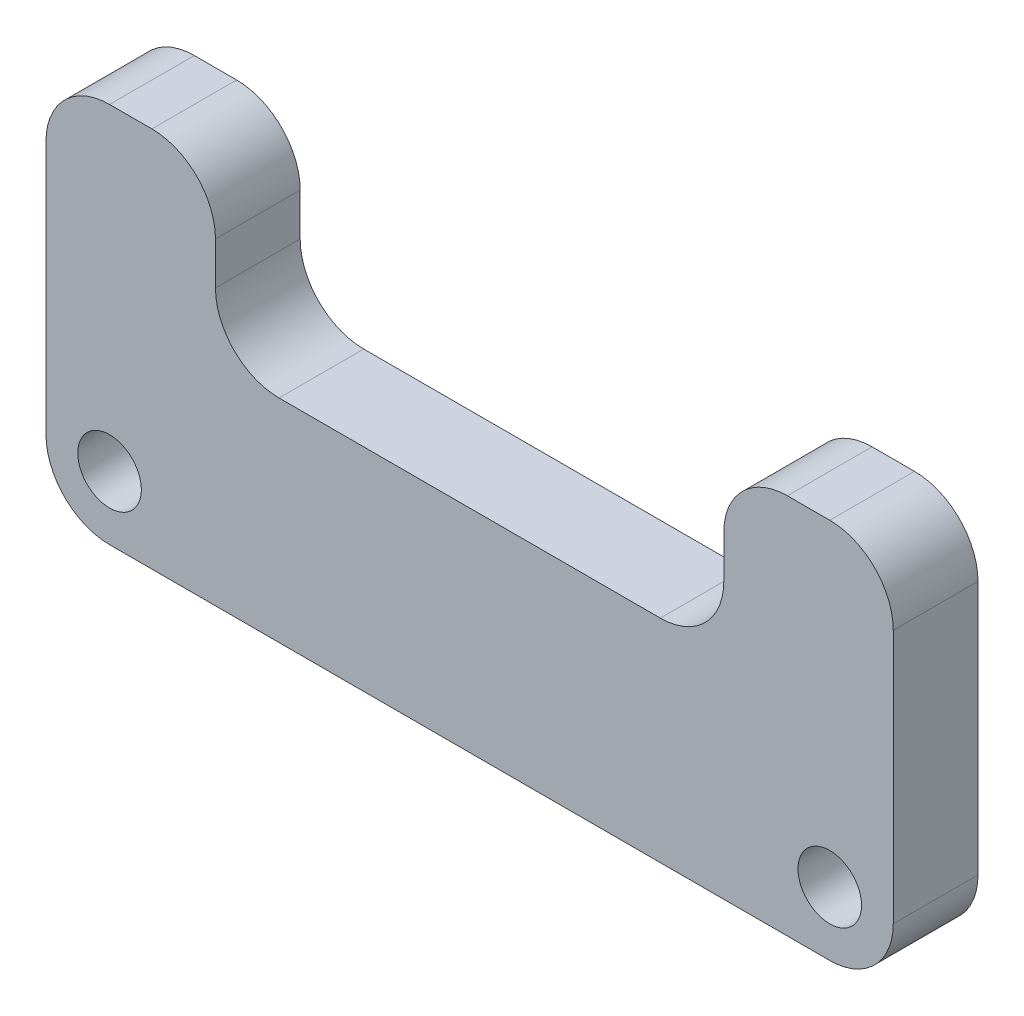
ISO-10303-21;
HEADER;
FILE_DESCRIPTION(('STEP AP214'),'2;1');
FILE_NAME('part.step','',(''),(''),'','','');
FILE_SCHEMA(('AUTOMOTIVE_DESIGN { 1 0 10303 214 1 1 1 1 }'));
ENDSEC;
DATA;
#1=APPLICATION_CONTEXT('core data for automotive mechanical design processes');
#2=APPLICATION_PROTOCOL_DEFINITION('international standard','automotive_design',2000,#1);
#3=PRODUCT_CONTEXT('',#1,'mechanical');
#4=PRODUCT('Part','Part','',(#3));
#5=PRODUCT_RELATED_PRODUCT_CATEGORY('part','',(#4));
#6=PRODUCT_DEFINITION_FORMATION('','',#4);
#7=PRODUCT_DEFINITION_CONTEXT('part definition',#1,'design');
#8=PRODUCT_DEFINITION('design','',#6,#7);
#9=PRODUCT_DEFINITION_SHAPE('','',#8);
#10=(LENGTH_UNIT() NAMED_UNIT(*) SI_UNIT(.MILLI.,.METRE.));
#11=(NAMED_UNIT(*) PLANE_ANGLE_UNIT() SI_UNIT($,.RADIAN.));
#12=(NAMED_UNIT(*) SI_UNIT($,.STERADIAN.) SOLID_ANGLE_UNIT());
#13=UNCERTAINTY_MEASURE_WITH_UNIT(LENGTH_MEASURE(1.E-05),#10,'distance_accuracy_value','');
#14=(GEOMETRIC_REPRESENTATION_CONTEXT(3) GLOBAL_UNCERTAINTY_ASSIGNED_CONTEXT((#13)) GLOBAL_UNIT_ASSIGNED_CONTEXT((#10,
#11,#12)) REPRESENTATION_CONTEXT('',''));
#15=CARTESIAN_POINT('',(0.,0.,0.));
#16=DIRECTION('',(0.,0.,1.));
#17=DIRECTION('',(1.,0.,0.));
#18=AXIS2_PLACEMENT_3D('',#15,#16,#17);
#19=CARTESIAN_POINT('',(-85.,15.,20.));
#20=DIRECTION('',(0.,0.,-1.));
#21=DIRECTION('',(-1.,0.,0.));
#22=AXIS2_PLACEMENT_3D('',#19,#20,#21);
#23=PLANE('',#22);
#24=CARTESIAN_POINT('',(-85.,15.,20.));
#25=DIRECTION('',(0.,0.,1.));
#26=DIRECTION('',(-1.,0.,0.));
#27=AXIS2_PLACEMENT_3D('',#24,#25,#26);
#28=CIRCLE('',#27,15.);
#29=CARTESIAN_POINT('',(-100.,15.0000000000002,20.));
#30=VERTEX_POINT('',#29);
#31=CARTESIAN_POINT('',(-85.,0.,20.));
#32=VERTEX_POINT('',#31);
#33=EDGE_CURVE('E240',#30,#32,#28,.T.);
#34=ORIENTED_EDGE('',*,*,#33,.T.);
#35=DIRECTION('',(1.,0.,0.));
#36=VECTOR('',#35,1.);
#37=CARTESIAN_POINT('',(-85.,0.,20.));
#38=LINE('',#37,#36);
#39=CARTESIAN_POINT('',(84.9999999999999,0.,20.));
#40=VERTEX_POINT('',#39);
#41=EDGE_CURVE('E128',#32,#40,#38,.T.);
#42=ORIENTED_EDGE('',*,*,#41,.T.);
#43=CARTESIAN_POINT('',(85.,15.,20.));
#44=DIRECTION('',(0.,0.,1.));
#45=DIRECTION('',(1.,0.,0.));
#46=AXIS2_PLACEMENT_3D('',#43,#44,#45);
#47=CIRCLE('',#46,15.);
#48=CARTESIAN_POINT('',(100.,15.,20.));
#49=VERTEX_POINT('',#48);
#50=EDGE_CURVE('E293',#40,#49,#47,.T.);
#51=ORIENTED_EDGE('',*,*,#50,.T.);
#52=DIRECTION('',(0.,1.,0.));
#53=VECTOR('',#52,1.);
#54=CARTESIAN_POINT('',(100.,15.0000000000001,20.));
#55=LINE('',#54,#53);
#56=CARTESIAN_POINT('',(100.,74.9999999999999,20.));
#57=VERTEX_POINT('',#56);
#58=EDGE_CURVE('E313',#49,#57,#55,.T.);
#59=ORIENTED_EDGE('',*,*,#58,.T.);
#60=CARTESIAN_POINT('',(85.,75.,20.));
#61=DIRECTION('',(0.,0.,1.));
#62=DIRECTION('',(1.,0.,0.));
#63=AXIS2_PLACEMENT_3D('',#60,#61,#62);
#64=CIRCLE('',#63,15.);
#65=CARTESIAN_POINT('',(84.9999999999999,90.,20.));
#66=VERTEX_POINT('',#65);
#67=EDGE_CURVE('E309',#57,#66,#64,.T.);
#68=ORIENTED_EDGE('',*,*,#67,.T.);
#69=DIRECTION('',(-1.,0.,0.));
#70=VECTOR('',#69,1.);
#71=CARTESIAN_POINT('',(84.9999999999999,90.,20.));
#72=LINE('',#71,#70);
#73=CARTESIAN_POINT('',(75.0000000000001,90.,20.));
#74=VERTEX_POINT('',#73);
#75=EDGE_CURVE('E312',#66,#74,#72,.T.);
#76=ORIENTED_EDGE('',*,*,#75,.T.);
#77=CARTESIAN_POINT('',(75.,75.,20.));
#78=DIRECTION('',(0.,0.,1.));
#79=DIRECTION('',(1.,0.,0.));
#80=AXIS2_PLACEMENT_3D('',#77,#78,#79);
#81=CIRCLE('',#80,15.);
#82=CARTESIAN_POINT('',(60.,74.9999999999999,20.));
#83=VERTEX_POINT('',#82);
#84=EDGE_CURVE('E317',#74,#83,#81,.T.);
#85=ORIENTED_EDGE('',*,*,#84,.T.);
#86=DIRECTION('',(0.,-1.,0.));
#87=VECTOR('',#86,1.);
#88=CARTESIAN_POINT('',(60.,74.9999999999999,20.));
#89=LINE('',#88,#87);
#90=CARTESIAN_POINT('',(60.,65.0000000000001,20.));
#91=VERTEX_POINT('',#90);
#92=EDGE_CURVE('E324',#83,#91,#89,.T.);
#93=ORIENTED_EDGE('',*,*,#92,.T.);
#94=CARTESIAN_POINT('',(45.,65.,20.));
#95=DIRECTION('',(0.,0.,-1.));
#96=DIRECTION('',(-1.,0.,0.));
#97=AXIS2_PLACEMENT_3D('',#94,#95,#96);
#98=CIRCLE('',#97,15.);
#99=CARTESIAN_POINT('',(44.9999999999999,50.,20.));
#100=VERTEX_POINT('',#99);
#101=EDGE_CURVE('E327',#91,#100,#98,.T.);
#102=ORIENTED_EDGE('',*,*,#101,.T.);
#103=DIRECTION('',(-1.,0.,0.));
#104=VECTOR('',#103,1.);
#105=CARTESIAN_POINT('',(44.9999999999999,50.,20.));
#106=LINE('',#105,#104);
#107=CARTESIAN_POINT('',(-44.9999999999999,50.,20.));
#108=VERTEX_POINT('',#107);
#109=EDGE_CURVE('E330',#100,#108,#106,.T.);
#110=ORIENTED_EDGE('',*,*,#109,.T.);
#111=CARTESIAN_POINT('',(-45.,65.,20.));
#112=DIRECTION('',(0.,0.,-1.));
#113=DIRECTION('',(1.,0.,0.));
#114=AXIS2_PLACEMENT_3D('',#111,#112,#113);
#115=CIRCLE('',#114,15.);
#116=CARTESIAN_POINT('',(-60.,65.0000000000001,20.));
#117=VERTEX_POINT('',#116);
#118=EDGE_CURVE('E333',#108,#117,#115,.T.);
#119=ORIENTED_EDGE('',*,*,#118,.T.);
#120=DIRECTION('',(0.,1.,0.));
#121=VECTOR('',#120,1.);
#122=CARTESIAN_POINT('',(-60.,74.9999999999999,20.));
#123=LINE('',#122,#121);
#124=CARTESIAN_POINT('',(-60.,74.9999999999999,20.));
#125=VERTEX_POINT('',#124);
#126=EDGE_CURVE('E336',#117,#125,#123,.T.);
#127=ORIENTED_EDGE('',*,*,#126,.T.);
#128=CARTESIAN_POINT('',(-75.,75.,20.));
#129=DIRECTION('',(0.,0.,1.));
#130=DIRECTION('',(-1.,0.,0.));
#131=AXIS2_PLACEMENT_3D('',#128,#129,#130);
#132=CIRCLE('',#131,15.);
#133=CARTESIAN_POINT('',(-75.0000000000001,90.,20.));
#134=VERTEX_POINT('',#133);
#135=EDGE_CURVE('E171',#125,#134,#132,.T.);
#136=ORIENTED_EDGE('',*,*,#135,.T.);
#137=DIRECTION('',(-1.,0.,0.));
#138=VECTOR('',#137,1.);
#139=CARTESIAN_POINT('',(-84.9999999999999,90.,20.));
#140=LINE('',#139,#138);
#141=CARTESIAN_POINT('',(-84.9999999999999,90.,20.));
#142=VERTEX_POINT('',#141);
#143=EDGE_CURVE('E165',#134,#142,#140,.T.);
#144=ORIENTED_EDGE('',*,*,#143,.T.);
#145=CARTESIAN_POINT('',(-85.,75.,20.));
#146=DIRECTION('',(0.,0.,1.));
#147=DIRECTION('',(-1.,0.,0.));
#148=AXIS2_PLACEMENT_3D('',#145,#146,#147);
#149=CIRCLE('',#148,15.);
#150=CARTESIAN_POINT('',(-100.,74.9999999999999,20.));
#151=VERTEX_POINT('',#150);
#152=EDGE_CURVE('E169',#142,#151,#149,.T.);
#153=ORIENTED_EDGE('',*,*,#152,.T.);
#154=DIRECTION('',(0.,-1.,0.));
#155=VECTOR('',#154,1.);
#156=CARTESIAN_POINT('',(-100.,15.0000000000002,20.));
#157=LINE('',#156,#155);
#158=EDGE_CURVE('E61',#151,#30,#157,.T.);
#159=ORIENTED_EDGE('',*,*,#158,.T.);
#160=EDGE_LOOP('',(#34,#42,#51,#59,#68,#76,#85,#93,#102,#110,#119,#127,#136,#144,#153,#159));
#161=FACE_BOUND('',#160,.T.);
#162=CARTESIAN_POINT('',(85.,15.,20.));
#163=DIRECTION('',(0.,0.,1.));
#164=DIRECTION('',(1.,0.,0.));
#165=AXIS2_PLACEMENT_3D('',#162,#163,#164);
#166=CIRCLE('',#165,7.50000000000001);
#167=CARTESIAN_POINT('',(92.5,15.,20.));
#168=VERTEX_POINT('',#167);
#169=EDGE_CURVE('E198',#168,#168,#166,.T.);
#170=ORIENTED_EDGE('',*,*,#169,.F.);
#171=EDGE_LOOP('',(#170));
#172=FACE_BOUND('',#171,.T.);
#173=CARTESIAN_POINT('',(-85.,15.,20.));
#174=DIRECTION('',(0.,0.,1.));
#175=DIRECTION('',(-1.,0.,0.));
#176=AXIS2_PLACEMENT_3D('',#173,#174,#175);
#177=CIRCLE('',#176,7.50000000000001);
#178=CARTESIAN_POINT('',(-92.5,15.,20.));
#179=VERTEX_POINT('',#178);
#180=EDGE_CURVE('E379',#179,#179,#177,.T.);
#181=ORIENTED_EDGE('',*,*,#180,.F.);
#182=EDGE_LOOP('',(#181));
#183=FACE_BOUND('',#182,.T.);
#184=ADVANCED_FACE('F43',(#161,#172,#183),#23,.F.);
#185=CARTESIAN_POINT('',(-85.,15.,0.));
#186=DIRECTION('',(0.,0.,-1.));
#187=DIRECTION('',(-1.,0.,0.));
#188=AXIS2_PLACEMENT_3D('',#185,#186,#187);
#189=PLANE('',#188);
#190=CARTESIAN_POINT('',(85.,15.,0.));
#191=DIRECTION('',(0.,0.,1.));
#192=DIRECTION('',(1.,0.,0.));
#193=AXIS2_PLACEMENT_3D('',#190,#191,#192);
#194=CIRCLE('',#193,7.50000000000001);
#195=CARTESIAN_POINT('',(92.5,15.,0.));
#196=VERTEX_POINT('',#195);
#197=EDGE_CURVE('E386',#196,#196,#194,.T.);
#198=ORIENTED_EDGE('',*,*,#197,.T.);
#199=EDGE_LOOP('',(#198));
#200=FACE_BOUND('',#199,.T.);
#201=CARTESIAN_POINT('',(-85.,15.,0.));
#202=DIRECTION('',(0.,0.,1.));
#203=DIRECTION('',(-1.,0.,0.));
#204=AXIS2_PLACEMENT_3D('',#201,#202,#203);
#205=CIRCLE('',#204,15.);
#206=CARTESIAN_POINT('',(-100.,15.0000000000002,0.));
#207=VERTEX_POINT('',#206);
#208=CARTESIAN_POINT('',(-85.,0.,0.));
#209=VERTEX_POINT('',#208);
#210=EDGE_CURVE('E193',#207,#209,#205,.T.);
#211=ORIENTED_EDGE('',*,*,#210,.F.);
#212=DIRECTION('',(0.,-1.,0.));
#213=VECTOR('',#212,1.);
#214=CARTESIAN_POINT('',(-100.,15.0000000000002,0.));
#215=LINE('',#214,#213);
#216=CARTESIAN_POINT('',(-100.,74.9999999999999,0.));
#217=VERTEX_POINT('',#216);
#218=EDGE_CURVE('E120',#217,#207,#215,.T.);
#219=ORIENTED_EDGE('',*,*,#218,.F.);
#220=CARTESIAN_POINT('',(-85.,75.,0.));
#221=DIRECTION('',(0.,0.,1.));
#222=DIRECTION('',(-1.,0.,0.));
#223=AXIS2_PLACEMENT_3D('',#220,#221,#222);
#224=CIRCLE('',#223,15.);
#225=CARTESIAN_POINT('',(-84.9999999999999,90.,0.));
#226=VERTEX_POINT('',#225);
#227=EDGE_CURVE('E114',#226,#217,#224,.T.);
#228=ORIENTED_EDGE('',*,*,#227,.F.);
#229=DIRECTION('',(-1.,0.,0.));
#230=VECTOR('',#229,1.);
#231=CARTESIAN_POINT('',(-84.9999999999999,90.,0.));
#232=LINE('',#231,#230);
#233=CARTESIAN_POINT('',(-75.0000000000001,90.,0.));
#234=VERTEX_POINT('',#233);
#235=EDGE_CURVE('E180',#234,#226,#232,.T.);
#236=ORIENTED_EDGE('',*,*,#235,.F.);
#237=CARTESIAN_POINT('',(-75.,75.,0.));
#238=DIRECTION('',(0.,0.,1.));
#239=DIRECTION('',(-1.,0.,0.));
#240=AXIS2_PLACEMENT_3D('',#237,#238,#239);
#241=CIRCLE('',#240,15.);
#242=CARTESIAN_POINT('',(-60.,74.9999999999999,0.));
#243=VERTEX_POINT('',#242);
#244=EDGE_CURVE('E231',#243,#234,#241,.T.);
#245=ORIENTED_EDGE('',*,*,#244,.F.);
#246=DIRECTION('',(0.,1.,0.));
#247=VECTOR('',#246,1.);
#248=CARTESIAN_POINT('',(-60.,74.9999999999999,0.));
#249=LINE('',#248,#247);
#250=CARTESIAN_POINT('',(-60.,65.0000000000001,0.));
#251=VERTEX_POINT('',#250);
#252=EDGE_CURVE('E228',#251,#243,#249,.T.);
#253=ORIENTED_EDGE('',*,*,#252,.F.);
#254=CARTESIAN_POINT('',(-45.,65.,0.));
#255=DIRECTION('',(0.,0.,-1.));
#256=DIRECTION('',(1.,0.,0.));
#257=AXIS2_PLACEMENT_3D('',#254,#255,#256);
#258=CIRCLE('',#257,15.);
#259=CARTESIAN_POINT('',(-44.9999999999999,50.,0.));
#260=VERTEX_POINT('',#259);
#261=EDGE_CURVE('E225',#260,#251,#258,.T.);
#262=ORIENTED_EDGE('',*,*,#261,.F.);
#263=DIRECTION('',(-1.,0.,0.));
#264=VECTOR('',#263,1.);
#265=CARTESIAN_POINT('',(44.9999999999999,50.,0.));
#266=LINE('',#265,#264);
#267=CARTESIAN_POINT('',(44.9999999999999,50.,0.));
#268=VERTEX_POINT('',#267);
#269=EDGE_CURVE('E222',#268,#260,#266,.T.);
#270=ORIENTED_EDGE('',*,*,#269,.F.);
#271=CARTESIAN_POINT('',(45.,65.,0.));
#272=DIRECTION('',(0.,0.,-1.));
#273=DIRECTION('',(-1.,0.,0.));
#274=AXIS2_PLACEMENT_3D('',#271,#272,#273);
#275=CIRCLE('',#274,15.);
#276=CARTESIAN_POINT('',(60.,65.0000000000001,0.));
#277=VERTEX_POINT('',#276);
#278=EDGE_CURVE('E219',#277,#268,#275,.T.);
#279=ORIENTED_EDGE('',*,*,#278,.F.);
#280=DIRECTION('',(0.,-1.,0.));
#281=VECTOR('',#280,1.);
#282=CARTESIAN_POINT('',(60.,74.9999999999999,0.));
#283=LINE('',#282,#281);
#284=CARTESIAN_POINT('',(60.,74.9999999999999,0.));
#285=VERTEX_POINT('',#284);
#286=EDGE_CURVE('E216',#285,#277,#283,.T.);
#287=ORIENTED_EDGE('',*,*,#286,.F.);
#288=CARTESIAN_POINT('',(75.,75.,0.));
#289=DIRECTION('',(0.,0.,1.));
#290=DIRECTION('',(1.,0.,0.));
#291=AXIS2_PLACEMENT_3D('',#288,#289,#290);
#292=CIRCLE('',#291,15.);
#293=CARTESIAN_POINT('',(75.0000000000001,90.,0.));
#294=VERTEX_POINT('',#293);
#295=EDGE_CURVE('E213',#294,#285,#292,.T.);
#296=ORIENTED_EDGE('',*,*,#295,.F.);
#297=DIRECTION('',(-1.,0.,0.));
#298=VECTOR('',#297,1.);
#299=CARTESIAN_POINT('',(84.9999999999999,90.,0.));
#300=LINE('',#299,#298);
#301=CARTESIAN_POINT('',(84.9999999999999,90.,0.));
#302=VERTEX_POINT('',#301);
#303=EDGE_CURVE('E210',#302,#294,#300,.T.);
#304=ORIENTED_EDGE('',*,*,#303,.F.);
#305=CARTESIAN_POINT('',(85.,75.,0.));
#306=DIRECTION('',(0.,0.,1.));
#307=DIRECTION('',(1.,0.,0.));
#308=AXIS2_PLACEMENT_3D('',#305,#306,#307);
#309=CIRCLE('',#308,15.);
#310=CARTESIAN_POINT('',(100.,74.9999999999999,0.));
#311=VERTEX_POINT('',#310);
#312=EDGE_CURVE('E207',#311,#302,#309,.T.);
#313=ORIENTED_EDGE('',*,*,#312,.F.);
#314=DIRECTION('',(0.,1.,0.));
#315=VECTOR('',#314,1.);
#316=CARTESIAN_POINT('',(100.,15.0000000000001,0.));
#317=LINE('',#316,#315);
#318=CARTESIAN_POINT('',(100.,15.,0.));
#319=VERTEX_POINT('',#318);
#320=EDGE_CURVE('E204',#319,#311,#317,.T.);
#321=ORIENTED_EDGE('',*,*,#320,.F.);
#322=CARTESIAN_POINT('',(85.,15.,0.));
#323=DIRECTION('',(0.,0.,1.));
#324=DIRECTION('',(1.,0.,0.));
#325=AXIS2_PLACEMENT_3D('',#322,#323,#324);
#326=CIRCLE('',#325,15.);
#327=CARTESIAN_POINT('',(84.9999999999999,0.,0.));
#328=VERTEX_POINT('',#327);
#329=EDGE_CURVE('E201',#328,#319,#326,.T.);
#330=ORIENTED_EDGE('',*,*,#329,.F.);
#331=DIRECTION('',(1.,0.,0.));
#332=VECTOR('',#331,1.);
#333=CARTESIAN_POINT('',(-85.,0.,0.));
#334=LINE('',#333,#332);
#335=EDGE_CURVE('E197',#209,#328,#334,.T.);
#336=ORIENTED_EDGE('',*,*,#335,.F.);
#337=EDGE_LOOP('',(#211,#219,#228,#236,#245,#253,#262,#270,#279,#287,#296,#304,#313,#321,#330,#336));
#338=FACE_BOUND('',#337,.T.);
#339=CARTESIAN_POINT('',(-85.,15.,0.));
#340=DIRECTION('',(0.,0.,1.));
#341=DIRECTION('',(-1.,0.,0.));
#342=AXIS2_PLACEMENT_3D('',#339,#340,#341);
#343=CIRCLE('',#342,7.50000000000001);
#344=CARTESIAN_POINT('',(-92.5,15.,0.));
#345=VERTEX_POINT('',#344);
#346=EDGE_CURVE('E382',#345,#345,#343,.T.);
#347=ORIENTED_EDGE('',*,*,#346,.T.);
#348=EDGE_LOOP('',(#347));
#349=FACE_BOUND('',#348,.T.);
#350=ADVANCED_FACE('F297',(#200,#338,#349),#189,.T.);
#351=CARTESIAN_POINT('',(-85.,15.,20.));
#352=DIRECTION('',(0.,0.,-1.));
#353=DIRECTION('',(-1.,0.,0.));
#354=AXIS2_PLACEMENT_3D('',#351,#352,#353);
#355=CYLINDRICAL_SURFACE('',#354,15.);
#356=ORIENTED_EDGE('',*,*,#210,.T.);
#357=DIRECTION('',(0.,0.,-1.));
#358=VECTOR('',#357,1.);
#359=CARTESIAN_POINT('',(-85.,0.,20.));
#360=LINE('',#359,#358);
#361=EDGE_CURVE('E11',#32,#209,#360,.T.);
#362=ORIENTED_EDGE('',*,*,#361,.F.);
#363=ORIENTED_EDGE('',*,*,#33,.F.);
#364=DIRECTION('',(0.,0.,-1.));
#365=VECTOR('',#364,1.);
#366=CARTESIAN_POINT('',(-100.,15.0000000000002,20.));
#367=LINE('',#366,#365);
#368=EDGE_CURVE('E189',#30,#207,#367,.T.);
#369=ORIENTED_EDGE('',*,*,#368,.T.);
#370=EDGE_LOOP('',(#356,#362,#363,#369));
#371=FACE_BOUND('',#370,.T.);
#372=ADVANCED_FACE('F45',(#371),#355,.T.);
#373=CARTESIAN_POINT('',(-85.,0.,20.));
#374=DIRECTION('',(0.,1.,0.));
#375=DIRECTION('',(-1.,0.,0.));
#376=AXIS2_PLACEMENT_3D('',#373,#374,#375);
#377=PLANE('',#376);
#378=ORIENTED_EDGE('',*,*,#335,.T.);
#379=DIRECTION('',(0.,0.,-1.));
#380=VECTOR('',#379,1.);
#381=CARTESIAN_POINT('',(84.9999999999999,0.,20.));
#382=LINE('',#381,#380);
#383=EDGE_CURVE('E53',#40,#328,#382,.T.);
#384=ORIENTED_EDGE('',*,*,#383,.F.);
#385=ORIENTED_EDGE('',*,*,#41,.F.);
#386=ORIENTED_EDGE('',*,*,#361,.T.);
#387=EDGE_LOOP('',(#378,#384,#385,#386));
#388=FACE_BOUND('',#387,.T.);
#389=ADVANCED_FACE('F540',(#388),#377,.F.);
#390=CARTESIAN_POINT('',(85.,15.,20.));
#391=DIRECTION('',(0.,0.,-1.));
#392=DIRECTION('',(-1.,0.,0.));
#393=AXIS2_PLACEMENT_3D('',#390,#391,#392);
#394=CYLINDRICAL_SURFACE('',#393,15.);
#395=ORIENTED_EDGE('',*,*,#329,.T.);
#396=DIRECTION('',(0.,0.,-1.));
#397=VECTOR('',#396,1.);
#398=CARTESIAN_POINT('',(100.,15.,20.));
#399=LINE('',#398,#397);
#400=EDGE_CURVE('E283',#49,#319,#399,.T.);
#401=ORIENTED_EDGE('',*,*,#400,.F.);
#402=ORIENTED_EDGE('',*,*,#50,.F.);
#403=ORIENTED_EDGE('',*,*,#383,.T.);
#404=EDGE_LOOP('',(#395,#401,#402,#403));
#405=FACE_BOUND('',#404,.T.);
#406=ADVANCED_FACE('F291',(#405),#394,.T.);
#407=CARTESIAN_POINT('',(100.,15.0000000000001,20.));
#408=DIRECTION('',(-1.,0.,0.));
#409=DIRECTION('',(0.,0.,1.));
#410=AXIS2_PLACEMENT_3D('',#407,#408,#409);
#411=PLANE('',#410);
#412=ORIENTED_EDGE('',*,*,#320,.T.);
#413=DIRECTION('',(0.,0.,-1.));
#414=VECTOR('',#413,1.);
#415=CARTESIAN_POINT('',(100.,74.9999999999999,20.));
#416=LINE('',#415,#414);
#417=EDGE_CURVE('E279',#57,#311,#416,.T.);
#418=ORIENTED_EDGE('',*,*,#417,.F.);
#419=ORIENTED_EDGE('',*,*,#58,.F.);
#420=ORIENTED_EDGE('',*,*,#400,.T.);
#421=EDGE_LOOP('',(#412,#418,#419,#420));
#422=FACE_BOUND('',#421,.T.);
#423=ADVANCED_FACE('F303',(#422),#411,.F.);
#424=CARTESIAN_POINT('',(85.,75.,20.));
#425=DIRECTION('',(0.,0.,-1.));
#426=DIRECTION('',(-1.,0.,0.));
#427=AXIS2_PLACEMENT_3D('',#424,#425,#426);
#428=CYLINDRICAL_SURFACE('',#427,15.);
#429=ORIENTED_EDGE('',*,*,#312,.T.);
#430=DIRECTION('',(0.,0.,-1.));
#431=VECTOR('',#430,1.);
#432=CARTESIAN_POINT('',(84.9999999999999,90.,20.));
#433=LINE('',#432,#431);
#434=EDGE_CURVE('E275',#66,#302,#433,.T.);
#435=ORIENTED_EDGE('',*,*,#434,.F.);
#436=ORIENTED_EDGE('',*,*,#67,.F.);
#437=ORIENTED_EDGE('',*,*,#417,.T.);
#438=EDGE_LOOP('',(#429,#435,#436,#437));
#439=FACE_BOUND('',#438,.T.);
#440=ADVANCED_FACE('F307',(#439),#428,.T.);
#441=CARTESIAN_POINT('',(84.9999999999999,90.,20.));
#442=DIRECTION('',(0.,-1.,0.));
#443=DIRECTION('',(0.,0.,-1.));
#444=AXIS2_PLACEMENT_3D('',#441,#442,#443);
#445=PLANE('',#444);
#446=ORIENTED_EDGE('',*,*,#303,.T.);
#447=DIRECTION('',(0.,0.,-1.));
#448=VECTOR('',#447,1.);
#449=CARTESIAN_POINT('',(75.0000000000001,90.,20.));
#450=LINE('',#449,#448);
#451=EDGE_CURVE('E271',#74,#294,#450,.T.);
#452=ORIENTED_EDGE('',*,*,#451,.F.);
#453=ORIENTED_EDGE('',*,*,#75,.F.);
#454=ORIENTED_EDGE('',*,*,#434,.T.);
#455=EDGE_LOOP('',(#446,#452,#453,#454));
#456=FACE_BOUND('',#455,.T.);
#457=ADVANCED_FACE('F501',(#456),#445,.F.);
#458=CARTESIAN_POINT('',(75.,75.,20.));
#459=DIRECTION('',(0.,0.,-1.));
#460=DIRECTION('',(-1.,0.,0.));
#461=AXIS2_PLACEMENT_3D('',#458,#459,#460);
#462=CYLINDRICAL_SURFACE('',#461,15.);
#463=ORIENTED_EDGE('',*,*,#295,.T.);
#464=DIRECTION('',(0.,0.,-1.));
#465=VECTOR('',#464,1.);
#466=CARTESIAN_POINT('',(60.,74.9999999999999,20.));
#467=LINE('',#466,#465);
#468=EDGE_CURVE('E267',#83,#285,#467,.T.);
#469=ORIENTED_EDGE('',*,*,#468,.F.);
#470=ORIENTED_EDGE('',*,*,#84,.F.);
#471=ORIENTED_EDGE('',*,*,#451,.T.);
#472=EDGE_LOOP('',(#463,#469,#470,#471));
#473=FACE_BOUND('',#472,.T.);
#474=ADVANCED_FACE('F490',(#473),#462,.T.);
#475=CARTESIAN_POINT('',(60.,74.9999999999999,20.));
#476=DIRECTION('',(1.,0.,0.));
#477=DIRECTION('',(0.,0.,-1.));
#478=AXIS2_PLACEMENT_3D('',#475,#476,#477);
#479=PLANE('',#478);
#480=ORIENTED_EDGE('',*,*,#286,.T.);
#481=DIRECTION('',(0.,0.,-1.));
#482=VECTOR('',#481,1.);
#483=CARTESIAN_POINT('',(60.,65.0000000000001,20.));
#484=LINE('',#483,#482);
#485=EDGE_CURVE('E263',#91,#277,#484,.T.);
#486=ORIENTED_EDGE('',*,*,#485,.F.);
#487=ORIENTED_EDGE('',*,*,#92,.F.);
#488=ORIENTED_EDGE('',*,*,#468,.T.);
#489=EDGE_LOOP('',(#480,#486,#487,#488));
#490=FACE_BOUND('',#489,.T.);
#491=ADVANCED_FACE('F479',(#490),#479,.F.);
#492=CARTESIAN_POINT('',(45.,65.,20.));
#493=DIRECTION('',(0.,0.,-1.));
#494=DIRECTION('',(-1.,0.,0.));
#495=AXIS2_PLACEMENT_3D('',#492,#493,#494);
#496=CYLINDRICAL_SURFACE('',#495,15.);
#497=ORIENTED_EDGE('',*,*,#278,.T.);
#498=DIRECTION('',(0.,0.,-1.));
#499=VECTOR('',#498,1.);
#500=CARTESIAN_POINT('',(44.9999999999999,50.,20.));
#501=LINE('',#500,#499);
#502=EDGE_CURVE('E259',#100,#268,#501,.T.);
#503=ORIENTED_EDGE('',*,*,#502,.F.);
#504=ORIENTED_EDGE('',*,*,#101,.F.);
#505=ORIENTED_EDGE('',*,*,#485,.T.);
#506=EDGE_LOOP('',(#497,#503,#504,#505));
#507=FACE_BOUND('',#506,.T.);
#508=ADVANCED_FACE('F468',(#507),#496,.F.);
#509=CARTESIAN_POINT('',(44.9999999999999,50.,20.));
#510=DIRECTION('',(0.,-1.,0.));
#511=DIRECTION('',(1.,0.,0.));
#512=AXIS2_PLACEMENT_3D('',#509,#510,#511);
#513=PLANE('',#512);
#514=ORIENTED_EDGE('',*,*,#269,.T.);
#515=DIRECTION('',(0.,0.,-1.));
#516=VECTOR('',#515,1.);
#517=CARTESIAN_POINT('',(-44.9999999999999,50.,20.));
#518=LINE('',#517,#516);
#519=EDGE_CURVE('E255',#108,#260,#518,.T.);
#520=ORIENTED_EDGE('',*,*,#519,.F.);
#521=ORIENTED_EDGE('',*,*,#109,.F.);
#522=ORIENTED_EDGE('',*,*,#502,.T.);
#523=EDGE_LOOP('',(#514,#520,#521,#522));
#524=FACE_BOUND('',#523,.T.);
#525=ADVANCED_FACE('F457',(#524),#513,.F.);
#526=CARTESIAN_POINT('',(-45.,65.,20.));
#527=DIRECTION('',(0.,0.,-1.));
#528=DIRECTION('',(-1.,0.,0.));
#529=AXIS2_PLACEMENT_3D('',#526,#527,#528);
#530=CYLINDRICAL_SURFACE('',#529,15.);
#531=ORIENTED_EDGE('',*,*,#261,.T.);
#532=DIRECTION('',(0.,0.,-1.));
#533=VECTOR('',#532,1.);
#534=CARTESIAN_POINT('',(-60.,65.0000000000001,20.));
#535=LINE('',#534,#533);
#536=EDGE_CURVE('E251',#117,#251,#535,.T.);
#537=ORIENTED_EDGE('',*,*,#536,.F.);
#538=ORIENTED_EDGE('',*,*,#118,.F.);
#539=ORIENTED_EDGE('',*,*,#519,.T.);
#540=EDGE_LOOP('',(#531,#537,#538,#539));
#541=FACE_BOUND('',#540,.T.);
#542=ADVANCED_FACE('F447',(#541),#530,.F.);
#543=CARTESIAN_POINT('',(-60.,74.9999999999999,20.));
#544=DIRECTION('',(-1.,0.,0.));
#545=DIRECTION('',(0.,-1.,0.));
#546=AXIS2_PLACEMENT_3D('',#543,#544,#545);
#547=PLANE('',#546);
#548=ORIENTED_EDGE('',*,*,#252,.T.);
#549=DIRECTION('',(0.,0.,-1.));
#550=VECTOR('',#549,1.);
#551=CARTESIAN_POINT('',(-60.,74.9999999999999,20.));
#552=LINE('',#551,#550);
#553=EDGE_CURVE('E247',#125,#243,#552,.T.);
#554=ORIENTED_EDGE('',*,*,#553,.F.);
#555=ORIENTED_EDGE('',*,*,#126,.F.);
#556=ORIENTED_EDGE('',*,*,#536,.T.);
#557=EDGE_LOOP('',(#548,#554,#555,#556));
#558=FACE_BOUND('',#557,.T.);
#559=ADVANCED_FACE('F344',(#558),#547,.F.);
#560=CARTESIAN_POINT('',(-75.,75.,20.));
#561=DIRECTION('',(0.,0.,-1.));
#562=DIRECTION('',(-1.,0.,0.));
#563=AXIS2_PLACEMENT_3D('',#560,#561,#562);
#564=CYLINDRICAL_SURFACE('',#563,15.);
#565=ORIENTED_EDGE('',*,*,#244,.T.);
#566=DIRECTION('',(0.,0.,-1.));
#567=VECTOR('',#566,1.);
#568=CARTESIAN_POINT('',(-75.0000000000001,90.,20.));
#569=LINE('',#568,#567);
#570=EDGE_CURVE('E182',#134,#234,#569,.T.);
#571=ORIENTED_EDGE('',*,*,#570,.F.);
#572=ORIENTED_EDGE('',*,*,#135,.F.);
#573=ORIENTED_EDGE('',*,*,#553,.T.);
#574=EDGE_LOOP('',(#565,#571,#572,#573));
#575=FACE_BOUND('',#574,.T.);
#576=ADVANCED_FACE('F348',(#575),#564,.T.);
#577=CARTESIAN_POINT('',(-84.9999999999999,90.,20.));
#578=DIRECTION('',(0.,-1.,0.));
#579=DIRECTION('',(0.,0.,-1.));
#580=AXIS2_PLACEMENT_3D('',#577,#578,#579);
#581=PLANE('',#580);
#582=ORIENTED_EDGE('',*,*,#235,.T.);
#583=DIRECTION('',(0.,0.,-1.));
#584=VECTOR('',#583,1.);
#585=CARTESIAN_POINT('',(-84.9999999999999,90.,20.));
#586=LINE('',#585,#584);
#587=EDGE_CURVE('E177',#142,#226,#586,.T.);
#588=ORIENTED_EDGE('',*,*,#587,.F.);
#589=ORIENTED_EDGE('',*,*,#143,.F.);
#590=ORIENTED_EDGE('',*,*,#570,.T.);
#591=EDGE_LOOP('',(#582,#588,#589,#590));
#592=FACE_BOUND('',#591,.T.);
#593=ADVANCED_FACE('F178',(#592),#581,.F.);
#594=CARTESIAN_POINT('',(-85.,75.,20.));
#595=DIRECTION('',(0.,0.,-1.));
#596=DIRECTION('',(-1.,0.,0.));
#597=AXIS2_PLACEMENT_3D('',#594,#595,#596);
#598=CYLINDRICAL_SURFACE('',#597,15.);
#599=ORIENTED_EDGE('',*,*,#227,.T.);
#600=DIRECTION('',(0.,0.,-1.));
#601=VECTOR('',#600,1.);
#602=CARTESIAN_POINT('',(-100.,74.9999999999999,20.));
#603=LINE('',#602,#601);
#604=EDGE_CURVE('E183',#151,#217,#603,.T.);
#605=ORIENTED_EDGE('',*,*,#604,.F.);
#606=ORIENTED_EDGE('',*,*,#152,.F.);
#607=ORIENTED_EDGE('',*,*,#587,.T.);
#608=EDGE_LOOP('',(#599,#605,#606,#607));
#609=FACE_BOUND('',#608,.T.);
#610=ADVANCED_FACE('F185',(#609),#598,.T.);
#611=CARTESIAN_POINT('',(-100.,15.0000000000002,20.));
#612=DIRECTION('',(1.,0.,0.));
#613=DIRECTION('',(0.,1.,0.));
#614=AXIS2_PLACEMENT_3D('',#611,#612,#613);
#615=PLANE('',#614);
#616=ORIENTED_EDGE('',*,*,#218,.T.);
#617=ORIENTED_EDGE('',*,*,#368,.F.);
#618=ORIENTED_EDGE('',*,*,#158,.F.);
#619=ORIENTED_EDGE('',*,*,#604,.T.);
#620=EDGE_LOOP('',(#616,#617,#618,#619));
#621=FACE_BOUND('',#620,.T.);
#622=ADVANCED_FACE('F352',(#621),#615,.F.);
#623=CARTESIAN_POINT('',(85.,15.,20.));
#624=DIRECTION('',(0.,0.,-1.));
#625=DIRECTION('',(-1.,0.,0.));
#626=AXIS2_PLACEMENT_3D('',#623,#624,#625);
#627=CYLINDRICAL_SURFACE('',#626,7.50000000000001);
#628=ORIENTED_EDGE('',*,*,#169,.T.);
#629=EDGE_LOOP('',(#628));
#630=FACE_BOUND('',#629,.T.);
#631=ORIENTED_EDGE('',*,*,#197,.F.);
#632=EDGE_LOOP('',(#631));
#633=FACE_BOUND('',#632,.T.);
#634=ADVANCED_FACE('F354',(#630,#633),#627,.F.);
#635=CARTESIAN_POINT('',(-85.,15.,20.));
#636=DIRECTION('',(0.,0.,-1.));
#637=DIRECTION('',(-1.,0.,0.));
#638=AXIS2_PLACEMENT_3D('',#635,#636,#637);
#639=CYLINDRICAL_SURFACE('',#638,7.50000000000001);
#640=ORIENTED_EDGE('',*,*,#180,.T.);
#641=EDGE_LOOP('',(#640));
#642=FACE_BOUND('',#641,.T.);
#643=ORIENTED_EDGE('',*,*,#346,.F.);
#644=EDGE_LOOP('',(#643));
#645=FACE_BOUND('',#644,.T.);
#646=ADVANCED_FACE('F360',(#642,#645),#639,.F.);
#647=CLOSED_SHELL('',(#184,#350,#372,#389,#406,#423,#440,#457,#474,#491,#508,#525,#542,#559,
#576,#593,#610,#622,#634,#646));
#648=MANIFOLD_SOLID_BREP('B2',#647);
#649=ADVANCED_BREP_SHAPE_REPRESENTATION('',(#18,#648),#14);
#650=SHAPE_DEFINITION_REPRESENTATION(#9,#649);
ENDSEC;
END-ISO-10303-21;
